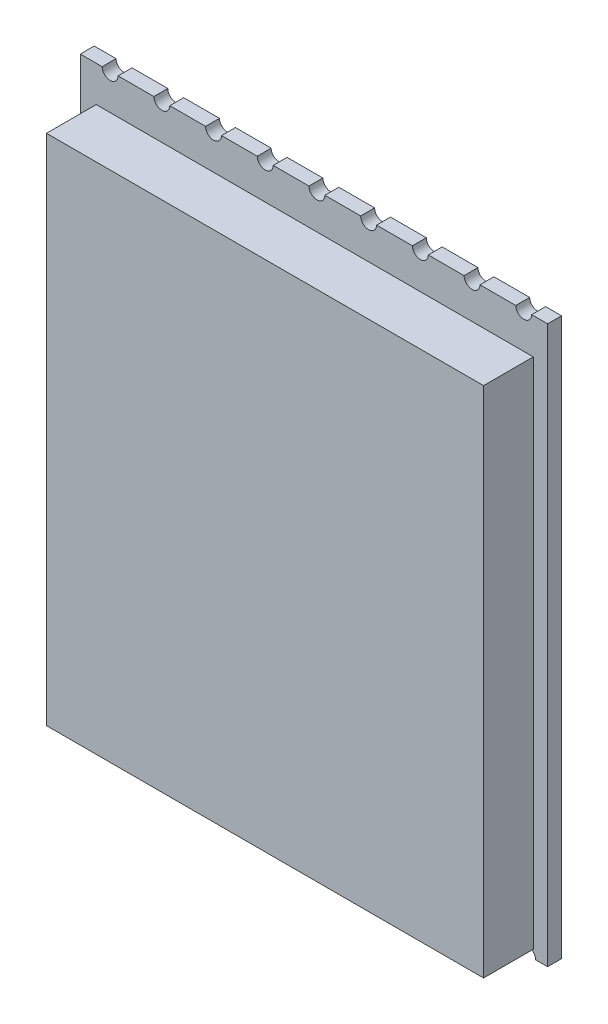
ISO-10303-21;
HEADER;
FILE_DESCRIPTION(('STEP AP214'),'2;1');
FILE_NAME('part.step','',(''),(''),'','','');
FILE_SCHEMA(('AUTOMOTIVE_DESIGN { 1 0 10303 214 1 1 1 1 }'));
ENDSEC;
DATA;
#1=APPLICATION_CONTEXT('core data for automotive mechanical design processes');
#2=APPLICATION_PROTOCOL_DEFINITION('international standard','automotive_design',2000,#1);
#3=PRODUCT_CONTEXT('',#1,'mechanical');
#4=PRODUCT('Part','Part','',(#3));
#5=PRODUCT_RELATED_PRODUCT_CATEGORY('part','',(#4));
#6=PRODUCT_DEFINITION_FORMATION('','',#4);
#7=PRODUCT_DEFINITION_CONTEXT('part definition',#1,'design');
#8=PRODUCT_DEFINITION('design','',#6,#7);
#9=PRODUCT_DEFINITION_SHAPE('','',#8);
#10=(LENGTH_UNIT() NAMED_UNIT(*) SI_UNIT(.MILLI.,.METRE.));
#11=(NAMED_UNIT(*) PLANE_ANGLE_UNIT() SI_UNIT($,.RADIAN.));
#12=(NAMED_UNIT(*) SI_UNIT($,.STERADIAN.) SOLID_ANGLE_UNIT());
#13=UNCERTAINTY_MEASURE_WITH_UNIT(LENGTH_MEASURE(1.E-05),#10,'distance_accuracy_value','');
#14=(GEOMETRIC_REPRESENTATION_CONTEXT(3) GLOBAL_UNCERTAINTY_ASSIGNED_CONTEXT((#13)) GLOBAL_UNIT_ASSIGNED_CONTEXT((#10,
#11,#12)) REPRESENTATION_CONTEXT('',''));
#15=CARTESIAN_POINT('',(0.,0.,0.));
#16=DIRECTION('',(0.,0.,1.));
#17=DIRECTION('',(1.,0.,0.));
#18=AXIS2_PLACEMENT_3D('',#15,#16,#17);
#19=CARTESIAN_POINT('',(0.,0.,0.7));
#20=DIRECTION('',(0.,1.,0.));
#21=DIRECTION('',(0.,0.,1.));
#22=AXIS2_PLACEMENT_3D('',#19,#20,#21);
#23=PLANE('',#22);
#24=DIRECTION('',(1.,0.,0.));
#25=VECTOR('',#24,1.);
#26=CARTESIAN_POINT('',(0.,0.,0.));
#27=LINE('',#26,#25);
#28=CARTESIAN_POINT('',(0.,0.,0.));
#29=VERTEX_POINT('',#28);
#30=CARTESIAN_POINT('',(16.9,0.,0.));
#31=VERTEX_POINT('',#30);
#32=EDGE_CURVE('E289',#29,#31,#27,.T.);
#33=ORIENTED_EDGE('',*,*,#32,.T.);
#34=DIRECTION('',(0.,0.,1.));
#35=VECTOR('',#34,1.);
#36=CARTESIAN_POINT('',(16.9,0.,-1.8));
#37=LINE('',#36,#35);
#38=CARTESIAN_POINT('',(16.9,0.,0.7));
#39=VERTEX_POINT('',#38);
#40=EDGE_CURVE('E46',#31,#39,#37,.T.);
#41=ORIENTED_EDGE('',*,*,#40,.T.);
#42=DIRECTION('',(1.,0.,0.));
#43=VECTOR('',#42,1.);
#44=CARTESIAN_POINT('',(0.,0.,0.7));
#45=LINE('',#44,#43);
#46=CARTESIAN_POINT('',(0.,0.,0.7));
#47=VERTEX_POINT('',#46);
#48=EDGE_CURVE('E267',#47,#39,#45,.T.);
#49=ORIENTED_EDGE('',*,*,#48,.F.);
#50=DIRECTION('',(0.,0.,-1.));
#51=VECTOR('',#50,1.);
#52=CARTESIAN_POINT('',(0.,0.,0.7));
#53=LINE('',#52,#51);
#54=EDGE_CURVE('E307',#47,#29,#53,.T.);
#55=ORIENTED_EDGE('',*,*,#54,.T.);
#56=EDGE_LOOP('',(#33,#41,#49,#55));
#57=FACE_BOUND('',#56,.T.);
#58=ADVANCED_FACE('F32',(#57),#23,.F.);
#59=CARTESIAN_POINT('',(0.,0.,0.7));
#60=DIRECTION('',(0.,0.,-1.));
#61=DIRECTION('',(-1.,0.,0.));
#62=AXIS2_PLACEMENT_3D('',#59,#60,#61);
#63=PLANE('',#62);
#64=ORIENTED_EDGE('',*,*,#48,.T.);
#65=CARTESIAN_POINT('',(17.3,0.,0.7));
#66=DIRECTION('',(0.,0.,1.));
#67=DIRECTION('',(1.,0.,0.));
#68=AXIS2_PLACEMENT_3D('',#65,#66,#67);
#69=CIRCLE('',#68,0.400000000000001);
#70=CARTESIAN_POINT('',(17.3,0.400000000000001,0.7));
#71=VERTEX_POINT('',#70);
#72=EDGE_CURVE('E263',#71,#39,#69,.T.);
#73=ORIENTED_EDGE('',*,*,#72,.F.);
#74=DIRECTION('',(1.,0.,0.));
#75=VECTOR('',#74,1.);
#76=CARTESIAN_POINT('',(0.800000000000003,0.4,0.7));
#77=LINE('',#76,#75);
#78=CARTESIAN_POINT('',(0.800000000000003,0.4,0.7));
#79=VERTEX_POINT('',#78);
#80=EDGE_CURVE('E488',#79,#71,#77,.T.);
#81=ORIENTED_EDGE('',*,*,#80,.F.);
#82=DIRECTION('',(0.,-1.,0.));
#83=VECTOR('',#82,1.);
#84=CARTESIAN_POINT('',(0.8,26.2,0.7));
#85=LINE('',#84,#83);
#86=CARTESIAN_POINT('',(0.8,26.2,0.7));
#87=VERTEX_POINT('',#86);
#88=EDGE_CURVE('E473',#87,#79,#85,.T.);
#89=ORIENTED_EDGE('',*,*,#88,.F.);
#90=DIRECTION('',(-1.,0.,0.));
#91=VECTOR('',#90,1.);
#92=CARTESIAN_POINT('',(0.8,26.2,0.7));
#93=LINE('',#92,#91);
#94=CARTESIAN_POINT('',(22.78,26.2,0.7));
#95=VERTEX_POINT('',#94);
#96=EDGE_CURVE('E478',#95,#87,#93,.T.);
#97=ORIENTED_EDGE('',*,*,#96,.F.);
#98=DIRECTION('',(0.,1.,0.));
#99=VECTOR('',#98,1.);
#100=CARTESIAN_POINT('',(22.78,26.2,0.7));
#101=LINE('',#100,#99);
#102=CARTESIAN_POINT('',(22.78,0.400000000000001,0.7));
#103=VERTEX_POINT('',#102);
#104=EDGE_CURVE('E490',#103,#95,#101,.T.);
#105=ORIENTED_EDGE('',*,*,#104,.F.);
#106=CARTESIAN_POINT('',(22.5,0.400000000000001,0.7));
#107=VERTEX_POINT('',#106);
#108=EDGE_CURVE('E487',#107,#103,#77,.T.);
#109=ORIENTED_EDGE('',*,*,#108,.F.);
#110=CARTESIAN_POINT('',(22.5,0.,0.7));
#111=DIRECTION('',(0.,0.,1.));
#112=DIRECTION('',(1.,0.,0.));
#113=AXIS2_PLACEMENT_3D('',#110,#111,#112);
#114=CIRCLE('',#113,0.400000000000001);
#115=CARTESIAN_POINT('',(22.9,0.,0.7));
#116=VERTEX_POINT('',#115);
#117=EDGE_CURVE('E376',#116,#107,#114,.T.);
#118=ORIENTED_EDGE('',*,*,#117,.F.);
#119=CARTESIAN_POINT('',(23.5,0.,0.7));
#120=VERTEX_POINT('',#119);
#121=EDGE_CURVE('E272',#116,#120,#45,.T.);
#122=ORIENTED_EDGE('',*,*,#121,.T.);
#123=DIRECTION('',(0.,1.,0.));
#124=VECTOR('',#123,1.);
#125=CARTESIAN_POINT('',(23.5,0.,0.7));
#126=LINE('',#125,#124);
#127=CARTESIAN_POINT('',(23.5,28.,0.7));
#128=VERTEX_POINT('',#127);
#129=EDGE_CURVE('E271',#120,#128,#126,.T.);
#130=ORIENTED_EDGE('',*,*,#129,.T.);
#131=DIRECTION('',(-1.,0.,0.));
#132=VECTOR('',#131,1.);
#133=CARTESIAN_POINT('',(0.,28.,0.7));
#134=LINE('',#133,#132);
#135=CARTESIAN_POINT('',(22.7,28.,0.7));
#136=VERTEX_POINT('',#135);
#137=EDGE_CURVE('E279',#128,#136,#134,.T.);
#138=ORIENTED_EDGE('',*,*,#137,.T.);
#139=CARTESIAN_POINT('',(22.3,28.,0.7));
#140=DIRECTION('',(0.,0.,1.));
#141=DIRECTION('',(1.,0.,0.));
#142=AXIS2_PLACEMENT_3D('',#139,#140,#141);
#143=CIRCLE('',#142,0.400000000000002);
#144=CARTESIAN_POINT('',(21.9,28.,0.7));
#145=VERTEX_POINT('',#144);
#146=EDGE_CURVE('E371',#145,#136,#143,.T.);
#147=ORIENTED_EDGE('',*,*,#146,.F.);
#148=CARTESIAN_POINT('',(20.1,28.,0.7));
#149=VERTEX_POINT('',#148);
#150=EDGE_CURVE('E283',#145,#149,#134,.T.);
#151=ORIENTED_EDGE('',*,*,#150,.T.);
#152=CARTESIAN_POINT('',(19.7,28.,0.7));
#153=DIRECTION('',(0.,0.,1.));
#154=DIRECTION('',(1.,0.,0.));
#155=AXIS2_PLACEMENT_3D('',#152,#153,#154);
#156=CIRCLE('',#155,0.400000000000002);
#157=CARTESIAN_POINT('',(19.3,28.,0.7));
#158=VERTEX_POINT('',#157);
#159=EDGE_CURVE('E396',#158,#149,#156,.T.);
#160=ORIENTED_EDGE('',*,*,#159,.F.);
#161=CARTESIAN_POINT('',(17.5,28.,0.7));
#162=VERTEX_POINT('',#161);
#163=EDGE_CURVE('E746',#158,#162,#134,.T.);
#164=ORIENTED_EDGE('',*,*,#163,.T.);
#165=CARTESIAN_POINT('',(17.1,28.,0.7));
#166=DIRECTION('',(0.,0.,1.));
#167=DIRECTION('',(1.,0.,0.));
#168=AXIS2_PLACEMENT_3D('',#165,#166,#167);
#169=CIRCLE('',#168,0.400000000000002);
#170=CARTESIAN_POINT('',(16.7,28.,0.7));
#171=VERTEX_POINT('',#170);
#172=EDGE_CURVE('E405',#171,#162,#169,.T.);
#173=ORIENTED_EDGE('',*,*,#172,.F.);
#174=CARTESIAN_POINT('',(14.9,28.,0.7));
#175=VERTEX_POINT('',#174);
#176=EDGE_CURVE('E743',#171,#175,#134,.T.);
#177=ORIENTED_EDGE('',*,*,#176,.T.);
#178=CARTESIAN_POINT('',(14.5,28.,0.7));
#179=DIRECTION('',(0.,0.,1.));
#180=DIRECTION('',(1.,0.,0.));
#181=AXIS2_PLACEMENT_3D('',#178,#179,#180);
#182=CIRCLE('',#181,0.400000000000002);
#183=CARTESIAN_POINT('',(14.1,28.,0.7));
#184=VERTEX_POINT('',#183);
#185=EDGE_CURVE('E414',#184,#175,#182,.T.);
#186=ORIENTED_EDGE('',*,*,#185,.F.);
#187=CARTESIAN_POINT('',(12.3,28.,0.7));
#188=VERTEX_POINT('',#187);
#189=EDGE_CURVE('E740',#184,#188,#134,.T.);
#190=ORIENTED_EDGE('',*,*,#189,.T.);
#191=CARTESIAN_POINT('',(11.9,28.,0.7));
#192=DIRECTION('',(0.,0.,1.));
#193=DIRECTION('',(1.,0.,0.));
#194=AXIS2_PLACEMENT_3D('',#191,#192,#193);
#195=CIRCLE('',#194,0.400000000000002);
#196=CARTESIAN_POINT('',(11.5,28.,0.7));
#197=VERTEX_POINT('',#196);
#198=EDGE_CURVE('E423',#197,#188,#195,.T.);
#199=ORIENTED_EDGE('',*,*,#198,.F.);
#200=CARTESIAN_POINT('',(9.7,28.,0.7));
#201=VERTEX_POINT('',#200);
#202=EDGE_CURVE('E737',#197,#201,#134,.T.);
#203=ORIENTED_EDGE('',*,*,#202,.T.);
#204=CARTESIAN_POINT('',(9.3,28.,0.7));
#205=DIRECTION('',(0.,0.,1.));
#206=DIRECTION('',(1.,0.,0.));
#207=AXIS2_PLACEMENT_3D('',#204,#205,#206);
#208=CIRCLE('',#207,0.400000000000002);
#209=CARTESIAN_POINT('',(8.9,28.,0.7));
#210=VERTEX_POINT('',#209);
#211=EDGE_CURVE('E432',#210,#201,#208,.T.);
#212=ORIENTED_EDGE('',*,*,#211,.F.);
#213=CARTESIAN_POINT('',(7.1,28.,0.7));
#214=VERTEX_POINT('',#213);
#215=EDGE_CURVE('E735',#210,#214,#134,.T.);
#216=ORIENTED_EDGE('',*,*,#215,.T.);
#217=CARTESIAN_POINT('',(6.7,28.,0.7));
#218=DIRECTION('',(0.,0.,1.));
#219=DIRECTION('',(1.,0.,0.));
#220=AXIS2_PLACEMENT_3D('',#217,#218,#219);
#221=CIRCLE('',#220,0.400000000000001);
#222=CARTESIAN_POINT('',(6.3,28.,0.7));
#223=VERTEX_POINT('',#222);
#224=EDGE_CURVE('E441',#223,#214,#221,.T.);
#225=ORIENTED_EDGE('',*,*,#224,.F.);
#226=CARTESIAN_POINT('',(4.5,28.,0.7));
#227=VERTEX_POINT('',#226);
#228=EDGE_CURVE('E734',#223,#227,#134,.T.);
#229=ORIENTED_EDGE('',*,*,#228,.T.);
#230=CARTESIAN_POINT('',(4.1,28.,0.7));
#231=DIRECTION('',(0.,0.,1.));
#232=DIRECTION('',(1.,0.,0.));
#233=AXIS2_PLACEMENT_3D('',#230,#231,#232);
#234=CIRCLE('',#233,0.400000000000001);
#235=CARTESIAN_POINT('',(3.7,28.,0.7));
#236=VERTEX_POINT('',#235);
#237=EDGE_CURVE('E450',#236,#227,#234,.T.);
#238=ORIENTED_EDGE('',*,*,#237,.F.);
#239=CARTESIAN_POINT('',(1.9,28.,0.7));
#240=VERTEX_POINT('',#239);
#241=EDGE_CURVE('E732',#236,#240,#134,.T.);
#242=ORIENTED_EDGE('',*,*,#241,.T.);
#243=CARTESIAN_POINT('',(1.5,28.,0.7));
#244=DIRECTION('',(0.,0.,1.));
#245=DIRECTION('',(1.,0.,0.));
#246=AXIS2_PLACEMENT_3D('',#243,#244,#245);
#247=CIRCLE('',#246,0.400000000000001);
#248=CARTESIAN_POINT('',(1.1,28.,0.7));
#249=VERTEX_POINT('',#248);
#250=EDGE_CURVE('E464',#249,#240,#247,.T.);
#251=ORIENTED_EDGE('',*,*,#250,.F.);
#252=CARTESIAN_POINT('',(0.,28.,0.7));
#253=VERTEX_POINT('',#252);
#254=EDGE_CURVE('E278',#249,#253,#134,.T.);
#255=ORIENTED_EDGE('',*,*,#254,.T.);
#256=DIRECTION('',(0.,-1.,0.));
#257=VECTOR('',#256,1.);
#258=CARTESIAN_POINT('',(0.,0.,0.7));
#259=LINE('',#258,#257);
#260=EDGE_CURVE('E275',#253,#47,#259,.T.);
#261=ORIENTED_EDGE('',*,*,#260,.T.);
#262=EDGE_LOOP('',(#64,#73,#81,#89,#97,#105,#109,#118,#122,#130,#138,#147,#151,#160,#164,#173,
#177,#186,#190,#199,#203,#212,#216,#225,#229,#238,#242,#251,#255,#261));
#263=FACE_BOUND('',#262,.T.);
#264=ADVANCED_FACE('F370',(#263),#63,.F.);
#265=CARTESIAN_POINT('',(17.7,0.,0.7));
#266=VERTEX_POINT('',#265);
#267=CARTESIAN_POINT('',(19.5,0.,0.7));
#268=VERTEX_POINT('',#267);
#269=EDGE_CURVE('E259',#266,#268,#45,.T.);
#270=ORIENTED_EDGE('',*,*,#269,.F.);
#271=DIRECTION('',(0.,0.,1.));
#272=VECTOR('',#271,1.);
#273=CARTESIAN_POINT('',(17.7,0.,-1.8));
#274=LINE('',#273,#272);
#275=CARTESIAN_POINT('',(17.7,0.,0.));
#276=VERTEX_POINT('',#275);
#277=EDGE_CURVE('E248',#266,#276,#274,.F.);
#278=ORIENTED_EDGE('',*,*,#277,.T.);
#279=CARTESIAN_POINT('',(19.5,0.,0.));
#280=VERTEX_POINT('',#279);
#281=EDGE_CURVE('E54',#276,#280,#27,.T.);
#282=ORIENTED_EDGE('',*,*,#281,.T.);
#283=DIRECTION('',(0.,0.,1.));
#284=VECTOR('',#283,1.);
#285=CARTESIAN_POINT('',(19.5,0.,-1.8));
#286=LINE('',#285,#284);
#287=EDGE_CURVE('E266',#280,#268,#286,.T.);
#288=ORIENTED_EDGE('',*,*,#287,.T.);
#289=EDGE_LOOP('',(#270,#278,#282,#288));
#290=FACE_BOUND('',#289,.T.);
#291=ADVANCED_FACE('F265',(#290),#23,.F.);
#292=CARTESIAN_POINT('',(19.9,0.400000000000001,0.7));
#293=VERTEX_POINT('',#292);
#294=EDGE_CURVE('E261',#71,#293,#77,.T.);
#295=ORIENTED_EDGE('',*,*,#294,.F.);
#296=EDGE_CURVE('E251',#266,#71,#69,.T.);
#297=ORIENTED_EDGE('',*,*,#296,.F.);
#298=ORIENTED_EDGE('',*,*,#269,.T.);
#299=CARTESIAN_POINT('',(19.9,0.,0.7));
#300=DIRECTION('',(0.,0.,1.));
#301=DIRECTION('',(1.,0.,0.));
#302=AXIS2_PLACEMENT_3D('',#299,#300,#301);
#303=CIRCLE('',#302,0.400000000000001);
#304=EDGE_CURVE('E386',#293,#268,#303,.T.);
#305=ORIENTED_EDGE('',*,*,#304,.F.);
#306=EDGE_LOOP('',(#295,#297,#298,#305));
#307=FACE_BOUND('',#306,.T.);
#308=ADVANCED_FACE('F257',(#307),#63,.F.);
#309=CARTESIAN_POINT('',(0.,28.,0.7));
#310=DIRECTION('',(0.,-1.,0.));
#311=DIRECTION('',(0.,0.,-1.));
#312=AXIS2_PLACEMENT_3D('',#309,#310,#311);
#313=PLANE('',#312);
#314=DIRECTION('',(-1.,0.,0.));
#315=VECTOR('',#314,1.);
#316=CARTESIAN_POINT('',(0.,28.,0.));
#317=LINE('',#316,#315);
#318=CARTESIAN_POINT('',(23.5,28.,0.));
#319=VERTEX_POINT('',#318);
#320=CARTESIAN_POINT('',(22.7,28.,0.));
#321=VERTEX_POINT('',#320);
#322=EDGE_CURVE('E295',#319,#321,#317,.T.);
#323=ORIENTED_EDGE('',*,*,#322,.T.);
#324=DIRECTION('',(0.,0.,1.));
#325=VECTOR('',#324,1.);
#326=CARTESIAN_POINT('',(22.7,28.,-1.8));
#327=LINE('',#326,#325);
#328=EDGE_CURVE('E367',#321,#136,#327,.T.);
#329=ORIENTED_EDGE('',*,*,#328,.T.);
#330=ORIENTED_EDGE('',*,*,#137,.F.);
#331=DIRECTION('',(0.,0.,-1.));
#332=VECTOR('',#331,1.);
#333=CARTESIAN_POINT('',(23.5,28.,0.7));
#334=LINE('',#333,#332);
#335=EDGE_CURVE('E301',#128,#319,#334,.T.);
#336=ORIENTED_EDGE('',*,*,#335,.T.);
#337=EDGE_LOOP('',(#323,#329,#330,#336));
#338=FACE_BOUND('',#337,.T.);
#339=ADVANCED_FACE('F365',(#338),#313,.F.);
#340=ORIENTED_EDGE('',*,*,#150,.F.);
#341=DIRECTION('',(0.,0.,1.));
#342=VECTOR('',#341,1.);
#343=CARTESIAN_POINT('',(21.9,28.,-1.8));
#344=LINE('',#343,#342);
#345=CARTESIAN_POINT('',(21.9,28.,0.));
#346=VERTEX_POINT('',#345);
#347=EDGE_CURVE('E392',#145,#346,#344,.F.);
#348=ORIENTED_EDGE('',*,*,#347,.T.);
#349=CARTESIAN_POINT('',(20.1,28.,0.));
#350=VERTEX_POINT('',#349);
#351=EDGE_CURVE('E298',#346,#350,#317,.T.);
#352=ORIENTED_EDGE('',*,*,#351,.T.);
#353=DIRECTION('',(0.,0.,1.));
#354=VECTOR('',#353,1.);
#355=CARTESIAN_POINT('',(20.1,28.,-1.8));
#356=LINE('',#355,#354);
#357=EDGE_CURVE('E402',#350,#149,#356,.T.);
#358=ORIENTED_EDGE('',*,*,#357,.T.);
#359=EDGE_LOOP('',(#340,#348,#352,#358));
#360=FACE_BOUND('',#359,.T.);
#361=ADVANCED_FACE('F700',(#360),#313,.F.);
#362=ORIENTED_EDGE('',*,*,#163,.F.);
#363=DIRECTION('',(0.,0.,1.));
#364=VECTOR('',#363,1.);
#365=CARTESIAN_POINT('',(19.3,28.,-1.8));
#366=LINE('',#365,#364);
#367=CARTESIAN_POINT('',(19.3,28.,0.));
#368=VERTEX_POINT('',#367);
#369=EDGE_CURVE('E399',#158,#368,#366,.F.);
#370=ORIENTED_EDGE('',*,*,#369,.T.);
#371=CARTESIAN_POINT('',(17.5,28.,0.));
#372=VERTEX_POINT('',#371);
#373=EDGE_CURVE('E704',#368,#372,#317,.T.);
#374=ORIENTED_EDGE('',*,*,#373,.T.);
#375=DIRECTION('',(0.,0.,1.));
#376=VECTOR('',#375,1.);
#377=CARTESIAN_POINT('',(17.5,28.,-1.8));
#378=LINE('',#377,#376);
#379=EDGE_CURVE('E411',#372,#162,#378,.T.);
#380=ORIENTED_EDGE('',*,*,#379,.T.);
#381=EDGE_LOOP('',(#362,#370,#374,#380));
#382=FACE_BOUND('',#381,.T.);
#383=ADVANCED_FACE('F751',(#382),#313,.F.);
#384=ORIENTED_EDGE('',*,*,#176,.F.);
#385=DIRECTION('',(0.,0.,1.));
#386=VECTOR('',#385,1.);
#387=CARTESIAN_POINT('',(16.7,28.,-1.8));
#388=LINE('',#387,#386);
#389=CARTESIAN_POINT('',(16.7,28.,0.));
#390=VERTEX_POINT('',#389);
#391=EDGE_CURVE('E408',#171,#390,#388,.F.);
#392=ORIENTED_EDGE('',*,*,#391,.T.);
#393=CARTESIAN_POINT('',(14.9,28.,0.));
#394=VERTEX_POINT('',#393);
#395=EDGE_CURVE('E705',#390,#394,#317,.T.);
#396=ORIENTED_EDGE('',*,*,#395,.T.);
#397=DIRECTION('',(0.,0.,1.));
#398=VECTOR('',#397,1.);
#399=CARTESIAN_POINT('',(14.9,28.,-1.8));
#400=LINE('',#399,#398);
#401=EDGE_CURVE('E420',#394,#175,#400,.T.);
#402=ORIENTED_EDGE('',*,*,#401,.T.);
#403=EDGE_LOOP('',(#384,#392,#396,#402));
#404=FACE_BOUND('',#403,.T.);
#405=ADVANCED_FACE('F754',(#404),#313,.F.);
#406=ORIENTED_EDGE('',*,*,#189,.F.);
#407=DIRECTION('',(0.,0.,1.));
#408=VECTOR('',#407,1.);
#409=CARTESIAN_POINT('',(14.1,28.,-1.8));
#410=LINE('',#409,#408);
#411=CARTESIAN_POINT('',(14.1,28.,0.));
#412=VERTEX_POINT('',#411);
#413=EDGE_CURVE('E417',#184,#412,#410,.F.);
#414=ORIENTED_EDGE('',*,*,#413,.T.);
#415=CARTESIAN_POINT('',(12.3,28.,0.));
#416=VERTEX_POINT('',#415);
#417=EDGE_CURVE('E708',#412,#416,#317,.T.);
#418=ORIENTED_EDGE('',*,*,#417,.T.);
#419=DIRECTION('',(0.,0.,1.));
#420=VECTOR('',#419,1.);
#421=CARTESIAN_POINT('',(12.3,28.,-1.8));
#422=LINE('',#421,#420);
#423=EDGE_CURVE('E429',#416,#188,#422,.T.);
#424=ORIENTED_EDGE('',*,*,#423,.T.);
#425=EDGE_LOOP('',(#406,#414,#418,#424));
#426=FACE_BOUND('',#425,.T.);
#427=ADVANCED_FACE('F759',(#426),#313,.F.);
#428=ORIENTED_EDGE('',*,*,#202,.F.);
#429=DIRECTION('',(0.,0.,1.));
#430=VECTOR('',#429,1.);
#431=CARTESIAN_POINT('',(11.5,28.,-1.8));
#432=LINE('',#431,#430);
#433=CARTESIAN_POINT('',(11.5,28.,0.));
#434=VERTEX_POINT('',#433);
#435=EDGE_CURVE('E426',#197,#434,#432,.F.);
#436=ORIENTED_EDGE('',*,*,#435,.T.);
#437=CARTESIAN_POINT('',(9.7,28.,0.));
#438=VERTEX_POINT('',#437);
#439=EDGE_CURVE('E712',#434,#438,#317,.T.);
#440=ORIENTED_EDGE('',*,*,#439,.T.);
#441=DIRECTION('',(0.,0.,1.));
#442=VECTOR('',#441,1.);
#443=CARTESIAN_POINT('',(9.7,28.,-1.8));
#444=LINE('',#443,#442);
#445=EDGE_CURVE('E438',#438,#201,#444,.T.);
#446=ORIENTED_EDGE('',*,*,#445,.T.);
#447=EDGE_LOOP('',(#428,#436,#440,#446));
#448=FACE_BOUND('',#447,.T.);
#449=ADVANCED_FACE('F568',(#448),#313,.F.);
#450=ORIENTED_EDGE('',*,*,#215,.F.);
#451=DIRECTION('',(0.,0.,1.));
#452=VECTOR('',#451,1.);
#453=CARTESIAN_POINT('',(8.9,28.,-1.8));
#454=LINE('',#453,#452);
#455=CARTESIAN_POINT('',(8.9,28.,0.));
#456=VERTEX_POINT('',#455);
#457=EDGE_CURVE('E435',#210,#456,#454,.F.);
#458=ORIENTED_EDGE('',*,*,#457,.T.);
#459=CARTESIAN_POINT('',(7.1,28.,0.));
#460=VERTEX_POINT('',#459);
#461=EDGE_CURVE('E716',#456,#460,#317,.T.);
#462=ORIENTED_EDGE('',*,*,#461,.T.);
#463=DIRECTION('',(0.,0.,1.));
#464=VECTOR('',#463,1.);
#465=CARTESIAN_POINT('',(7.1,28.,-1.8));
#466=LINE('',#465,#464);
#467=EDGE_CURVE('E447',#460,#214,#466,.T.);
#468=ORIENTED_EDGE('',*,*,#467,.T.);
#469=EDGE_LOOP('',(#450,#458,#462,#468));
#470=FACE_BOUND('',#469,.T.);
#471=ADVANCED_FACE('F563',(#470),#313,.F.);
#472=ORIENTED_EDGE('',*,*,#228,.F.);
#473=DIRECTION('',(0.,0.,1.));
#474=VECTOR('',#473,1.);
#475=CARTESIAN_POINT('',(6.3,28.,-1.8));
#476=LINE('',#475,#474);
#477=CARTESIAN_POINT('',(6.3,28.,0.));
#478=VERTEX_POINT('',#477);
#479=EDGE_CURVE('E444',#223,#478,#476,.F.);
#480=ORIENTED_EDGE('',*,*,#479,.T.);
#481=CARTESIAN_POINT('',(4.5,28.,0.));
#482=VERTEX_POINT('',#481);
#483=EDGE_CURVE('E720',#478,#482,#317,.T.);
#484=ORIENTED_EDGE('',*,*,#483,.T.);
#485=DIRECTION('',(0.,0.,1.));
#486=VECTOR('',#485,1.);
#487=CARTESIAN_POINT('',(4.5,28.,-1.8));
#488=LINE('',#487,#486);
#489=EDGE_CURVE('E456',#482,#227,#488,.T.);
#490=ORIENTED_EDGE('',*,*,#489,.T.);
#491=EDGE_LOOP('',(#472,#480,#484,#490));
#492=FACE_BOUND('',#491,.T.);
#493=ADVANCED_FACE('F556',(#492),#313,.F.);
#494=CARTESIAN_POINT('',(20.3,0.,0.7));
#495=VERTEX_POINT('',#494);
#496=CARTESIAN_POINT('',(22.1,0.,0.7));
#497=VERTEX_POINT('',#496);
#498=EDGE_CURVE('E268',#495,#497,#45,.T.);
#499=ORIENTED_EDGE('',*,*,#498,.F.);
#500=DIRECTION('',(0.,0.,1.));
#501=VECTOR('',#500,1.);
#502=CARTESIAN_POINT('',(20.3,0.,-1.8));
#503=LINE('',#502,#501);
#504=CARTESIAN_POINT('',(20.3,0.,0.));
#505=VERTEX_POINT('',#504);
#506=EDGE_CURVE('E334',#495,#505,#503,.F.);
#507=ORIENTED_EDGE('',*,*,#506,.T.);
#508=CARTESIAN_POINT('',(22.1,0.,0.));
#509=VERTEX_POINT('',#508);
#510=EDGE_CURVE('E342',#505,#509,#27,.T.);
#511=ORIENTED_EDGE('',*,*,#510,.T.);
#512=DIRECTION('',(0.,0.,1.));
#513=VECTOR('',#512,1.);
#514=CARTESIAN_POINT('',(22.1,0.,-1.8));
#515=LINE('',#514,#513);
#516=EDGE_CURVE('E462',#509,#497,#515,.T.);
#517=ORIENTED_EDGE('',*,*,#516,.T.);
#518=EDGE_LOOP('',(#499,#507,#511,#517));
#519=FACE_BOUND('',#518,.T.);
#520=ADVANCED_FACE('F340',(#519),#23,.F.);
#521=ORIENTED_EDGE('',*,*,#241,.F.);
#522=DIRECTION('',(0.,0.,1.));
#523=VECTOR('',#522,1.);
#524=CARTESIAN_POINT('',(3.7,28.,-1.8));
#525=LINE('',#524,#523);
#526=CARTESIAN_POINT('',(3.7,28.,0.));
#527=VERTEX_POINT('',#526);
#528=EDGE_CURVE('E453',#236,#527,#525,.F.);
#529=ORIENTED_EDGE('',*,*,#528,.T.);
#530=CARTESIAN_POINT('',(1.9,28.,0.));
#531=VERTEX_POINT('',#530);
#532=EDGE_CURVE('E723',#527,#531,#317,.T.);
#533=ORIENTED_EDGE('',*,*,#532,.T.);
#534=DIRECTION('',(0.,0.,1.));
#535=VECTOR('',#534,1.);
#536=CARTESIAN_POINT('',(1.9,28.,-1.8));
#537=LINE('',#536,#535);
#538=EDGE_CURVE('E470',#531,#240,#537,.T.);
#539=ORIENTED_EDGE('',*,*,#538,.T.);
#540=EDGE_LOOP('',(#521,#529,#533,#539));
#541=FACE_BOUND('',#540,.T.);
#542=ADVANCED_FACE('F555',(#541),#313,.F.);
#543=EDGE_CURVE('E519',#293,#107,#77,.T.);
#544=ORIENTED_EDGE('',*,*,#543,.F.);
#545=EDGE_CURVE('E344',#495,#293,#303,.T.);
#546=ORIENTED_EDGE('',*,*,#545,.F.);
#547=ORIENTED_EDGE('',*,*,#498,.T.);
#548=EDGE_CURVE('E459',#107,#497,#114,.T.);
#549=ORIENTED_EDGE('',*,*,#548,.F.);
#550=EDGE_LOOP('',(#544,#546,#547,#549));
#551=FACE_BOUND('',#550,.T.);
#552=ADVANCED_FACE('F523',(#551),#63,.F.);
#553=CARTESIAN_POINT('',(0.,0.,0.7));
#554=DIRECTION('',(1.,0.,0.));
#555=DIRECTION('',(0.,0.,-1.));
#556=AXIS2_PLACEMENT_3D('',#553,#554,#555);
#557=PLANE('',#556);
#558=DIRECTION('',(0.,-1.,0.));
#559=VECTOR('',#558,1.);
#560=CARTESIAN_POINT('',(0.,0.,0.));
#561=LINE('',#560,#559);
#562=CARTESIAN_POINT('',(0.,28.,0.));
#563=VERTEX_POINT('',#562);
#564=EDGE_CURVE('E284',#563,#29,#561,.T.);
#565=ORIENTED_EDGE('',*,*,#564,.T.);
#566=ORIENTED_EDGE('',*,*,#54,.F.);
#567=ORIENTED_EDGE('',*,*,#260,.F.);
#568=DIRECTION('',(0.,0.,-1.));
#569=VECTOR('',#568,1.);
#570=CARTESIAN_POINT('',(0.,28.,0.7));
#571=LINE('',#570,#569);
#572=EDGE_CURVE('E282',#253,#563,#571,.T.);
#573=ORIENTED_EDGE('',*,*,#572,.T.);
#574=EDGE_LOOP('',(#565,#566,#567,#573));
#575=FACE_BOUND('',#574,.T.);
#576=ADVANCED_FACE('F34',(#575),#557,.F.);
#577=ORIENTED_EDGE('',*,*,#121,.F.);
#578=DIRECTION('',(0.,0.,1.));
#579=VECTOR('',#578,1.);
#580=CARTESIAN_POINT('',(22.9,0.,-1.8));
#581=LINE('',#580,#579);
#582=CARTESIAN_POINT('',(22.9,0.,0.));
#583=VERTEX_POINT('',#582);
#584=EDGE_CURVE('E355',#116,#583,#581,.F.);
#585=ORIENTED_EDGE('',*,*,#584,.T.);
#586=CARTESIAN_POINT('',(23.5,0.,0.));
#587=VERTEX_POINT('',#586);
#588=EDGE_CURVE('E287',#583,#587,#27,.T.);
#589=ORIENTED_EDGE('',*,*,#588,.T.);
#590=DIRECTION('',(0.,0.,-1.));
#591=VECTOR('',#590,1.);
#592=CARTESIAN_POINT('',(23.5,0.,0.7));
#593=LINE('',#592,#591);
#594=EDGE_CURVE('E304',#120,#587,#593,.T.);
#595=ORIENTED_EDGE('',*,*,#594,.F.);
#596=EDGE_LOOP('',(#577,#585,#589,#595));
#597=FACE_BOUND('',#596,.T.);
#598=ADVANCED_FACE('F353',(#597),#23,.F.);
#599=CARTESIAN_POINT('',(23.5,0.,0.7));
#600=DIRECTION('',(-1.,0.,0.));
#601=DIRECTION('',(0.,0.,1.));
#602=AXIS2_PLACEMENT_3D('',#599,#600,#601);
#603=PLANE('',#602);
#604=DIRECTION('',(0.,1.,0.));
#605=VECTOR('',#604,1.);
#606=CARTESIAN_POINT('',(23.5,0.,0.));
#607=LINE('',#606,#605);
#608=EDGE_CURVE('E292',#587,#319,#607,.T.);
#609=ORIENTED_EDGE('',*,*,#608,.T.);
#610=ORIENTED_EDGE('',*,*,#335,.F.);
#611=ORIENTED_EDGE('',*,*,#129,.F.);
#612=ORIENTED_EDGE('',*,*,#594,.T.);
#613=EDGE_LOOP('',(#609,#610,#611,#612));
#614=FACE_BOUND('',#613,.T.);
#615=ADVANCED_FACE('F358',(#614),#603,.F.);
#616=ORIENTED_EDGE('',*,*,#254,.F.);
#617=DIRECTION('',(0.,0.,1.));
#618=VECTOR('',#617,1.);
#619=CARTESIAN_POINT('',(1.1,28.,-1.8));
#620=LINE('',#619,#618);
#621=CARTESIAN_POINT('',(1.1,28.,0.));
#622=VERTEX_POINT('',#621);
#623=EDGE_CURVE('E467',#249,#622,#620,.F.);
#624=ORIENTED_EDGE('',*,*,#623,.T.);
#625=EDGE_CURVE('E294',#622,#563,#317,.T.);
#626=ORIENTED_EDGE('',*,*,#625,.T.);
#627=ORIENTED_EDGE('',*,*,#572,.F.);
#628=EDGE_LOOP('',(#616,#624,#626,#627));
#629=FACE_BOUND('',#628,.T.);
#630=ADVANCED_FACE('F553',(#629),#313,.F.);
#631=CARTESIAN_POINT('',(0.,0.,0.));
#632=DIRECTION('',(0.,0.,-1.));
#633=DIRECTION('',(-1.,0.,0.));
#634=AXIS2_PLACEMENT_3D('',#631,#632,#633);
#635=PLANE('',#634);
#636=CARTESIAN_POINT('',(17.3,0.,0.));
#637=DIRECTION('',(0.,0.,-1.));
#638=DIRECTION('',(-1.,0.,0.));
#639=AXIS2_PLACEMENT_3D('',#636,#637,#638);
#640=CIRCLE('',#639,0.400000000000001);
#641=EDGE_CURVE('E11',#31,#276,#640,.T.);
#642=ORIENTED_EDGE('',*,*,#641,.F.);
#643=ORIENTED_EDGE('',*,*,#32,.F.);
#644=ORIENTED_EDGE('',*,*,#564,.F.);
#645=ORIENTED_EDGE('',*,*,#625,.F.);
#646=CARTESIAN_POINT('',(1.5,28.,0.));
#647=DIRECTION('',(0.,0.,-1.));
#648=DIRECTION('',(-1.,0.,0.));
#649=AXIS2_PLACEMENT_3D('',#646,#647,#648);
#650=CIRCLE('',#649,0.400000000000001);
#651=EDGE_CURVE('E310',#531,#622,#650,.T.);
#652=ORIENTED_EDGE('',*,*,#651,.F.);
#653=ORIENTED_EDGE('',*,*,#532,.F.);
#654=CARTESIAN_POINT('',(4.1,28.,0.));
#655=DIRECTION('',(0.,0.,-1.));
#656=DIRECTION('',(-1.,0.,0.));
#657=AXIS2_PLACEMENT_3D('',#654,#655,#656);
#658=CIRCLE('',#657,0.400000000000001);
#659=EDGE_CURVE('E314',#482,#527,#658,.T.);
#660=ORIENTED_EDGE('',*,*,#659,.F.);
#661=ORIENTED_EDGE('',*,*,#483,.F.);
#662=CARTESIAN_POINT('',(6.7,28.,0.));
#663=DIRECTION('',(0.,0.,-1.));
#664=DIRECTION('',(-1.,0.,0.));
#665=AXIS2_PLACEMENT_3D('',#662,#663,#664);
#666=CIRCLE('',#665,0.400000000000001);
#667=EDGE_CURVE('E316',#460,#478,#666,.T.);
#668=ORIENTED_EDGE('',*,*,#667,.F.);
#669=ORIENTED_EDGE('',*,*,#461,.F.);
#670=CARTESIAN_POINT('',(9.3,28.,0.));
#671=DIRECTION('',(0.,0.,-1.));
#672=DIRECTION('',(-1.,0.,0.));
#673=AXIS2_PLACEMENT_3D('',#670,#671,#672);
#674=CIRCLE('',#673,0.400000000000002);
#675=EDGE_CURVE('E318',#438,#456,#674,.T.);
#676=ORIENTED_EDGE('',*,*,#675,.F.);
#677=ORIENTED_EDGE('',*,*,#439,.F.);
#678=CARTESIAN_POINT('',(11.9,28.,0.));
#679=DIRECTION('',(0.,0.,-1.));
#680=DIRECTION('',(-1.,0.,0.));
#681=AXIS2_PLACEMENT_3D('',#678,#679,#680);
#682=CIRCLE('',#681,0.400000000000002);
#683=EDGE_CURVE('E320',#416,#434,#682,.T.);
#684=ORIENTED_EDGE('',*,*,#683,.F.);
#685=ORIENTED_EDGE('',*,*,#417,.F.);
#686=CARTESIAN_POINT('',(14.5,28.,0.));
#687=DIRECTION('',(0.,0.,-1.));
#688=DIRECTION('',(-1.,0.,0.));
#689=AXIS2_PLACEMENT_3D('',#686,#687,#688);
#690=CIRCLE('',#689,0.400000000000002);
#691=EDGE_CURVE('E322',#394,#412,#690,.T.);
#692=ORIENTED_EDGE('',*,*,#691,.F.);
#693=ORIENTED_EDGE('',*,*,#395,.F.);
#694=CARTESIAN_POINT('',(17.1,28.,0.));
#695=DIRECTION('',(0.,0.,-1.));
#696=DIRECTION('',(-1.,0.,0.));
#697=AXIS2_PLACEMENT_3D('',#694,#695,#696);
#698=CIRCLE('',#697,0.400000000000002);
#699=EDGE_CURVE('E324',#372,#390,#698,.T.);
#700=ORIENTED_EDGE('',*,*,#699,.F.);
#701=ORIENTED_EDGE('',*,*,#373,.F.);
#702=CARTESIAN_POINT('',(19.7,28.,0.));
#703=DIRECTION('',(0.,0.,-1.));
#704=DIRECTION('',(-1.,0.,0.));
#705=AXIS2_PLACEMENT_3D('',#702,#703,#704);
#706=CIRCLE('',#705,0.400000000000002);
#707=EDGE_CURVE('E326',#350,#368,#706,.T.);
#708=ORIENTED_EDGE('',*,*,#707,.F.);
#709=ORIENTED_EDGE('',*,*,#351,.F.);
#710=CARTESIAN_POINT('',(22.3,28.,0.));
#711=DIRECTION('',(0.,0.,-1.));
#712=DIRECTION('',(-1.,0.,0.));
#713=AXIS2_PLACEMENT_3D('',#710,#711,#712);
#714=CIRCLE('',#713,0.400000000000002);
#715=EDGE_CURVE('E328',#321,#346,#714,.T.);
#716=ORIENTED_EDGE('',*,*,#715,.F.);
#717=ORIENTED_EDGE('',*,*,#322,.F.);
#718=ORIENTED_EDGE('',*,*,#608,.F.);
#719=ORIENTED_EDGE('',*,*,#588,.F.);
#720=CARTESIAN_POINT('',(22.5,0.,0.));
#721=DIRECTION('',(0.,0.,-1.));
#722=DIRECTION('',(-1.,0.,0.));
#723=AXIS2_PLACEMENT_3D('',#720,#721,#722);
#724=CIRCLE('',#723,0.400000000000001);
#725=EDGE_CURVE('E312',#509,#583,#724,.T.);
#726=ORIENTED_EDGE('',*,*,#725,.F.);
#727=ORIENTED_EDGE('',*,*,#510,.F.);
#728=CARTESIAN_POINT('',(19.9,0.,0.));
#729=DIRECTION('',(0.,0.,-1.));
#730=DIRECTION('',(-1.,0.,0.));
#731=AXIS2_PLACEMENT_3D('',#728,#729,#730);
#732=CIRCLE('',#731,0.400000000000001);
#733=EDGE_CURVE('E40',#280,#505,#732,.T.);
#734=ORIENTED_EDGE('',*,*,#733,.F.);
#735=ORIENTED_EDGE('',*,*,#281,.F.);
#736=EDGE_LOOP('',(#642,#643,#644,#645,#652,#653,#660,#661,#668,#669,#676,#677,#684,#685,#692,
#693,#700,#701,#708,#709,#716,#717,#718,#719,#726,#727,#734,#735));
#737=FACE_BOUND('',#736,.T.);
#738=ADVANCED_FACE('F347',(#737),#635,.T.);
#739=CARTESIAN_POINT('',(0.8,26.2,3.2));
#740=DIRECTION('',(1.,0.,0.));
#741=DIRECTION('',(0.,1.,0.));
#742=AXIS2_PLACEMENT_3D('',#739,#740,#741);
#743=PLANE('',#742);
#744=ORIENTED_EDGE('',*,*,#88,.T.);
#745=DIRECTION('',(0.,0.,-1.));
#746=VECTOR('',#745,1.);
#747=CARTESIAN_POINT('',(0.800000000000003,0.4,3.2));
#748=LINE('',#747,#746);
#749=CARTESIAN_POINT('',(0.800000000000003,0.4,3.2));
#750=VERTEX_POINT('',#749);
#751=EDGE_CURVE('E288',#750,#79,#748,.T.);
#752=ORIENTED_EDGE('',*,*,#751,.F.);
#753=DIRECTION('',(0.,-1.,0.));
#754=VECTOR('',#753,1.);
#755=CARTESIAN_POINT('',(0.8,26.2,3.2));
#756=LINE('',#755,#754);
#757=CARTESIAN_POINT('',(0.8,26.2,3.2));
#758=VERTEX_POINT('',#757);
#759=EDGE_CURVE('E474',#758,#750,#756,.T.);
#760=ORIENTED_EDGE('',*,*,#759,.F.);
#761=DIRECTION('',(0.,0.,-1.));
#762=VECTOR('',#761,1.);
#763=CARTESIAN_POINT('',(0.8,26.2,3.2));
#764=LINE('',#763,#762);
#765=EDGE_CURVE('E484',#758,#87,#764,.T.);
#766=ORIENTED_EDGE('',*,*,#765,.T.);
#767=EDGE_LOOP('',(#744,#752,#760,#766));
#768=FACE_BOUND('',#767,.T.);
#769=ADVANCED_FACE('F509',(#768),#743,.F.);
#770=CARTESIAN_POINT('',(0.800000000000003,0.4,3.2));
#771=DIRECTION('',(0.,1.,0.));
#772=DIRECTION('',(-1.,0.,0.));
#773=AXIS2_PLACEMENT_3D('',#770,#771,#772);
#774=PLANE('',#773);
#775=ORIENTED_EDGE('',*,*,#80,.T.);
#776=ORIENTED_EDGE('',*,*,#294,.T.);
#777=ORIENTED_EDGE('',*,*,#543,.T.);
#778=ORIENTED_EDGE('',*,*,#108,.T.);
#779=DIRECTION('',(0.,0.,-1.));
#780=VECTOR('',#779,1.);
#781=CARTESIAN_POINT('',(22.78,0.400000000000001,3.2));
#782=LINE('',#781,#780);
#783=CARTESIAN_POINT('',(22.78,0.400000000000001,3.2));
#784=VERTEX_POINT('',#783);
#785=EDGE_CURVE('E500',#784,#103,#782,.T.);
#786=ORIENTED_EDGE('',*,*,#785,.F.);
#787=DIRECTION('',(1.,0.,0.));
#788=VECTOR('',#787,1.);
#789=CARTESIAN_POINT('',(0.800000000000003,0.4,3.2));
#790=LINE('',#789,#788);
#791=EDGE_CURVE('E477',#750,#784,#790,.T.);
#792=ORIENTED_EDGE('',*,*,#791,.F.);
#793=ORIENTED_EDGE('',*,*,#751,.T.);
#794=EDGE_LOOP('',(#775,#776,#777,#778,#786,#792,#793));
#795=FACE_BOUND('',#794,.T.);
#796=ADVANCED_FACE('F505',(#795),#774,.F.);
#797=CARTESIAN_POINT('',(22.78,26.2,3.2));
#798=DIRECTION('',(-1.,0.,0.));
#799=DIRECTION('',(0.,-1.,0.));
#800=AXIS2_PLACEMENT_3D('',#797,#798,#799);
#801=PLANE('',#800);
#802=ORIENTED_EDGE('',*,*,#104,.T.);
#803=DIRECTION('',(0.,0.,-1.));
#804=VECTOR('',#803,1.);
#805=CARTESIAN_POINT('',(22.78,26.2,3.2));
#806=LINE('',#805,#804);
#807=CARTESIAN_POINT('',(22.78,26.2,3.2));
#808=VERTEX_POINT('',#807);
#809=EDGE_CURVE('E497',#808,#95,#806,.T.);
#810=ORIENTED_EDGE('',*,*,#809,.F.);
#811=DIRECTION('',(0.,1.,0.));
#812=VECTOR('',#811,1.);
#813=CARTESIAN_POINT('',(22.78,26.2,3.2));
#814=LINE('',#813,#812);
#815=EDGE_CURVE('E480',#784,#808,#814,.T.);
#816=ORIENTED_EDGE('',*,*,#815,.F.);
#817=ORIENTED_EDGE('',*,*,#785,.T.);
#818=EDGE_LOOP('',(#802,#810,#816,#817));
#819=FACE_BOUND('',#818,.T.);
#820=ADVANCED_FACE('F518',(#819),#801,.F.);
#821=CARTESIAN_POINT('',(0.8,26.2,3.2));
#822=DIRECTION('',(0.,-1.,0.));
#823=DIRECTION('',(1.,0.,0.));
#824=AXIS2_PLACEMENT_3D('',#821,#822,#823);
#825=PLANE('',#824);
#826=ORIENTED_EDGE('',*,*,#96,.T.);
#827=ORIENTED_EDGE('',*,*,#765,.F.);
#828=DIRECTION('',(-1.,0.,0.));
#829=VECTOR('',#828,1.);
#830=CARTESIAN_POINT('',(0.8,26.2,3.2));
#831=LINE('',#830,#829);
#832=EDGE_CURVE('E482',#808,#758,#831,.T.);
#833=ORIENTED_EDGE('',*,*,#832,.F.);
#834=ORIENTED_EDGE('',*,*,#809,.T.);
#835=EDGE_LOOP('',(#826,#827,#833,#834));
#836=FACE_BOUND('',#835,.T.);
#837=ADVANCED_FACE('F513',(#836),#825,.F.);
#838=CARTESIAN_POINT('',(0.,0.,3.2));
#839=DIRECTION('',(0.,0.,1.));
#840=DIRECTION('',(1.,0.,0.));
#841=AXIS2_PLACEMENT_3D('',#838,#839,#840);
#842=PLANE('',#841);
#843=ORIENTED_EDGE('',*,*,#759,.T.);
#844=ORIENTED_EDGE('',*,*,#791,.T.);
#845=ORIENTED_EDGE('',*,*,#815,.T.);
#846=ORIENTED_EDGE('',*,*,#832,.T.);
#847=EDGE_LOOP('',(#843,#844,#845,#846));
#848=FACE_BOUND('',#847,.T.);
#849=ADVANCED_FACE('F538',(#848),#842,.T.);
#850=CARTESIAN_POINT('',(1.5,28.,-1.8));
#851=DIRECTION('',(0.,0.,1.));
#852=DIRECTION('',(1.,0.,0.));
#853=AXIS2_PLACEMENT_3D('',#850,#851,#852);
#854=CYLINDRICAL_SURFACE('',#853,0.400000000000001);
#855=ORIENTED_EDGE('',*,*,#651,.T.);
#856=ORIENTED_EDGE('',*,*,#623,.F.);
#857=ORIENTED_EDGE('',*,*,#250,.T.);
#858=ORIENTED_EDGE('',*,*,#538,.F.);
#859=EDGE_LOOP('',(#855,#856,#857,#858));
#860=FACE_BOUND('',#859,.T.);
#861=ADVANCED_FACE('F529',(#860),#854,.F.);
#862=CARTESIAN_POINT('',(22.5,0.,-1.8));
#863=DIRECTION('',(0.,0.,1.));
#864=DIRECTION('',(1.,0.,0.));
#865=AXIS2_PLACEMENT_3D('',#862,#863,#864);
#866=CYLINDRICAL_SURFACE('',#865,0.400000000000001);
#867=ORIENTED_EDGE('',*,*,#725,.T.);
#868=ORIENTED_EDGE('',*,*,#584,.F.);
#869=ORIENTED_EDGE('',*,*,#117,.T.);
#870=ORIENTED_EDGE('',*,*,#548,.T.);
#871=ORIENTED_EDGE('',*,*,#516,.F.);
#872=EDGE_LOOP('',(#867,#868,#869,#870,#871));
#873=FACE_BOUND('',#872,.T.);
#874=ADVANCED_FACE('F526',(#873),#866,.F.);
#875=CARTESIAN_POINT('',(4.1,28.,-1.8));
#876=DIRECTION('',(0.,0.,1.));
#877=DIRECTION('',(1.,0.,0.));
#878=AXIS2_PLACEMENT_3D('',#875,#876,#877);
#879=CYLINDRICAL_SURFACE('',#878,0.400000000000001);
#880=ORIENTED_EDGE('',*,*,#659,.T.);
#881=ORIENTED_EDGE('',*,*,#528,.F.);
#882=ORIENTED_EDGE('',*,*,#237,.T.);
#883=ORIENTED_EDGE('',*,*,#489,.F.);
#884=EDGE_LOOP('',(#880,#881,#882,#883));
#885=FACE_BOUND('',#884,.T.);
#886=ADVANCED_FACE('F528',(#885),#879,.F.);
#887=CARTESIAN_POINT('',(6.7,28.,-1.8));
#888=DIRECTION('',(0.,0.,1.));
#889=DIRECTION('',(1.,0.,0.));
#890=AXIS2_PLACEMENT_3D('',#887,#888,#889);
#891=CYLINDRICAL_SURFACE('',#890,0.400000000000001);
#892=ORIENTED_EDGE('',*,*,#667,.T.);
#893=ORIENTED_EDGE('',*,*,#479,.F.);
#894=ORIENTED_EDGE('',*,*,#224,.T.);
#895=ORIENTED_EDGE('',*,*,#467,.F.);
#896=EDGE_LOOP('',(#892,#893,#894,#895));
#897=FACE_BOUND('',#896,.T.);
#898=ADVANCED_FACE('F535',(#897),#891,.F.);
#899=CARTESIAN_POINT('',(9.3,28.,-1.8));
#900=DIRECTION('',(0.,0.,1.));
#901=DIRECTION('',(1.,0.,0.));
#902=AXIS2_PLACEMENT_3D('',#899,#900,#901);
#903=CYLINDRICAL_SURFACE('',#902,0.400000000000002);
#904=ORIENTED_EDGE('',*,*,#675,.T.);
#905=ORIENTED_EDGE('',*,*,#457,.F.);
#906=ORIENTED_EDGE('',*,*,#211,.T.);
#907=ORIENTED_EDGE('',*,*,#445,.F.);
#908=EDGE_LOOP('',(#904,#905,#906,#907));
#909=FACE_BOUND('',#908,.T.);
#910=ADVANCED_FACE('F619',(#909),#903,.F.);
#911=CARTESIAN_POINT('',(11.9,28.,-1.8));
#912=DIRECTION('',(0.,0.,1.));
#913=DIRECTION('',(1.,0.,0.));
#914=AXIS2_PLACEMENT_3D('',#911,#912,#913);
#915=CYLINDRICAL_SURFACE('',#914,0.400000000000002);
#916=ORIENTED_EDGE('',*,*,#683,.T.);
#917=ORIENTED_EDGE('',*,*,#435,.F.);
#918=ORIENTED_EDGE('',*,*,#198,.T.);
#919=ORIENTED_EDGE('',*,*,#423,.F.);
#920=EDGE_LOOP('',(#916,#917,#918,#919));
#921=FACE_BOUND('',#920,.T.);
#922=ADVANCED_FACE('F629',(#921),#915,.F.);
#923=CARTESIAN_POINT('',(14.5,28.,-1.8));
#924=DIRECTION('',(0.,0.,1.));
#925=DIRECTION('',(1.,0.,0.));
#926=AXIS2_PLACEMENT_3D('',#923,#924,#925);
#927=CYLINDRICAL_SURFACE('',#926,0.400000000000002);
#928=ORIENTED_EDGE('',*,*,#691,.T.);
#929=ORIENTED_EDGE('',*,*,#413,.F.);
#930=ORIENTED_EDGE('',*,*,#185,.T.);
#931=ORIENTED_EDGE('',*,*,#401,.F.);
#932=EDGE_LOOP('',(#928,#929,#930,#931));
#933=FACE_BOUND('',#932,.T.);
#934=ADVANCED_FACE('F639',(#933),#927,.F.);
#935=CARTESIAN_POINT('',(17.1,28.,-1.8));
#936=DIRECTION('',(0.,0.,1.));
#937=DIRECTION('',(1.,0.,0.));
#938=AXIS2_PLACEMENT_3D('',#935,#936,#937);
#939=CYLINDRICAL_SURFACE('',#938,0.400000000000002);
#940=ORIENTED_EDGE('',*,*,#699,.T.);
#941=ORIENTED_EDGE('',*,*,#391,.F.);
#942=ORIENTED_EDGE('',*,*,#172,.T.);
#943=ORIENTED_EDGE('',*,*,#379,.F.);
#944=EDGE_LOOP('',(#940,#941,#942,#943));
#945=FACE_BOUND('',#944,.T.);
#946=ADVANCED_FACE('F649',(#945),#939,.F.);
#947=CARTESIAN_POINT('',(19.7,28.,-1.8));
#948=DIRECTION('',(0.,0.,1.));
#949=DIRECTION('',(1.,0.,0.));
#950=AXIS2_PLACEMENT_3D('',#947,#948,#949);
#951=CYLINDRICAL_SURFACE('',#950,0.400000000000002);
#952=ORIENTED_EDGE('',*,*,#707,.T.);
#953=ORIENTED_EDGE('',*,*,#369,.F.);
#954=ORIENTED_EDGE('',*,*,#159,.T.);
#955=ORIENTED_EDGE('',*,*,#357,.F.);
#956=EDGE_LOOP('',(#952,#953,#954,#955));
#957=FACE_BOUND('',#956,.T.);
#958=ADVANCED_FACE('F659',(#957),#951,.F.);
#959=CARTESIAN_POINT('',(22.3,28.,-1.8));
#960=DIRECTION('',(0.,0.,1.));
#961=DIRECTION('',(1.,0.,0.));
#962=AXIS2_PLACEMENT_3D('',#959,#960,#961);
#963=CYLINDRICAL_SURFACE('',#962,0.400000000000002);
#964=ORIENTED_EDGE('',*,*,#715,.T.);
#965=ORIENTED_EDGE('',*,*,#347,.F.);
#966=ORIENTED_EDGE('',*,*,#146,.T.);
#967=ORIENTED_EDGE('',*,*,#328,.F.);
#968=EDGE_LOOP('',(#964,#965,#966,#967));
#969=FACE_BOUND('',#968,.T.);
#970=ADVANCED_FACE('F669',(#969),#963,.F.);
#971=CARTESIAN_POINT('',(19.9,0.,-1.8));
#972=DIRECTION('',(0.,0.,1.));
#973=DIRECTION('',(1.,0.,0.));
#974=AXIS2_PLACEMENT_3D('',#971,#972,#973);
#975=CYLINDRICAL_SURFACE('',#974,0.400000000000001);
#976=ORIENTED_EDGE('',*,*,#733,.T.);
#977=ORIENTED_EDGE('',*,*,#506,.F.);
#978=ORIENTED_EDGE('',*,*,#545,.T.);
#979=ORIENTED_EDGE('',*,*,#304,.T.);
#980=ORIENTED_EDGE('',*,*,#287,.F.);
#981=EDGE_LOOP('',(#976,#977,#978,#979,#980));
#982=FACE_BOUND('',#981,.T.);
#983=ADVANCED_FACE('F332',(#982),#975,.F.);
#984=CARTESIAN_POINT('',(17.3,0.,-1.8));
#985=DIRECTION('',(0.,0.,1.));
#986=DIRECTION('',(1.,0.,0.));
#987=AXIS2_PLACEMENT_3D('',#984,#985,#986);
#988=CYLINDRICAL_SURFACE('',#987,0.400000000000001);
#989=ORIENTED_EDGE('',*,*,#641,.T.);
#990=ORIENTED_EDGE('',*,*,#277,.F.);
#991=ORIENTED_EDGE('',*,*,#296,.T.);
#992=ORIENTED_EDGE('',*,*,#72,.T.);
#993=ORIENTED_EDGE('',*,*,#40,.F.);
#994=EDGE_LOOP('',(#989,#990,#991,#992,#993));
#995=FACE_BOUND('',#994,.T.);
#996=ADVANCED_FACE('F250',(#995),#988,.F.);
#997=CLOSED_SHELL('',(#58,#264,#291,#308,#339,#361,#383,#405,#427,#449,#471,#493,#520,#542,#552,
#576,#598,#615,#630,#738,#769,#796,#820,#837,#849,#861,#874,#886,#898,#910,#922,#934,#946,#958,
#970,#983,#996));
#998=MANIFOLD_SOLID_BREP('B2',#997);
#999=ADVANCED_BREP_SHAPE_REPRESENTATION('',(#18,#998),#14);
#1000=SHAPE_DEFINITION_REPRESENTATION(#9,#999);
ENDSEC;
END-ISO-10303-21;
